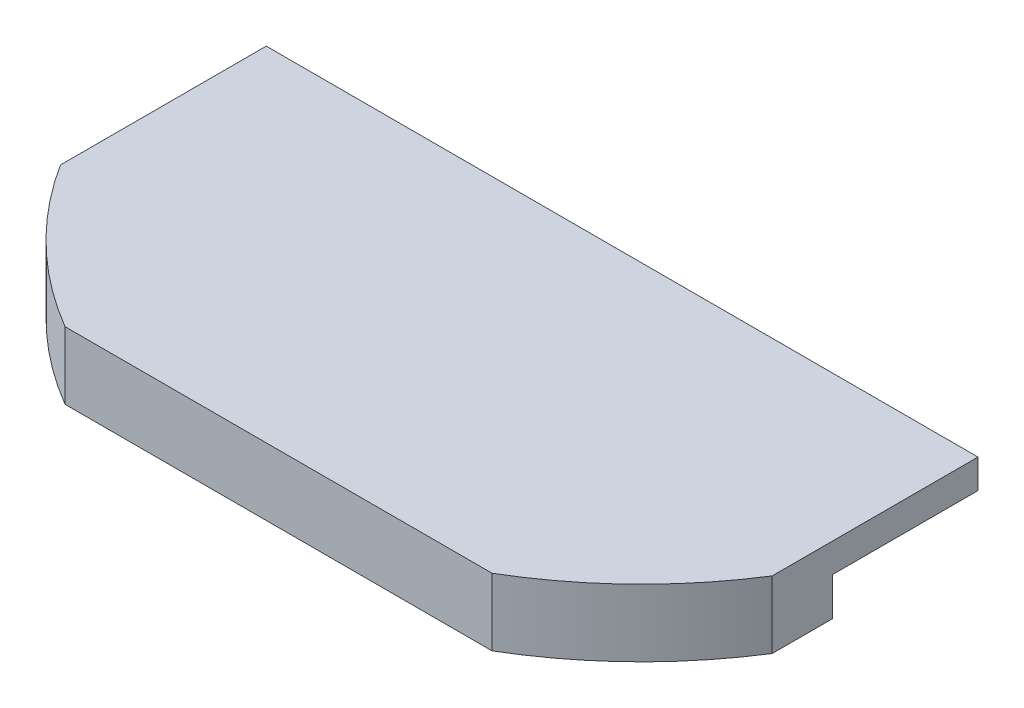
ISO-10303-21;
HEADER;
FILE_DESCRIPTION(('STEP AP214'),'2;1');
FILE_NAME('part.step','',(''),(''),'','','');
FILE_SCHEMA(('AUTOMOTIVE_DESIGN { 1 0 10303 214 1 1 1 1 }'));
ENDSEC;
DATA;
#1=APPLICATION_CONTEXT('core data for automotive mechanical design processes');
#2=APPLICATION_PROTOCOL_DEFINITION('international standard','automotive_design',2000,#1);
#3=PRODUCT_CONTEXT('',#1,'mechanical');
#4=PRODUCT('Part','Part','',(#3));
#5=PRODUCT_RELATED_PRODUCT_CATEGORY('part','',(#4));
#6=PRODUCT_DEFINITION_FORMATION('','',#4);
#7=PRODUCT_DEFINITION_CONTEXT('part definition',#1,'design');
#8=PRODUCT_DEFINITION('design','',#6,#7);
#9=PRODUCT_DEFINITION_SHAPE('','',#8);
#10=(LENGTH_UNIT() NAMED_UNIT(*) SI_UNIT(.MILLI.,.METRE.));
#11=(NAMED_UNIT(*) PLANE_ANGLE_UNIT() SI_UNIT($,.RADIAN.));
#12=(NAMED_UNIT(*) SI_UNIT($,.STERADIAN.) SOLID_ANGLE_UNIT());
#13=UNCERTAINTY_MEASURE_WITH_UNIT(LENGTH_MEASURE(1.E-05),#10,'distance_accuracy_value','');
#14=(GEOMETRIC_REPRESENTATION_CONTEXT(3) GLOBAL_UNCERTAINTY_ASSIGNED_CONTEXT((#13)) GLOBAL_UNIT_ASSIGNED_CONTEXT((#10,
#11,#12)) REPRESENTATION_CONTEXT('',''));
#15=CARTESIAN_POINT('',(0.,0.,0.));
#16=DIRECTION('',(0.,0.,1.));
#17=DIRECTION('',(1.,0.,0.));
#18=AXIS2_PLACEMENT_3D('',#15,#16,#17);
#19=CARTESIAN_POINT('',(0.,0.33,-9.79999999999999));
#20=DIRECTION('',(0.,-1.,0.));
#21=DIRECTION('',(0.,0.,-1.));
#22=AXIS2_PLACEMENT_3D('',#19,#20,#21);
#23=CYLINDRICAL_SURFACE('',#22,27.);
#24=DIRECTION('',(0.,-1.,0.));
#25=VECTOR('',#24,1.);
#26=CARTESIAN_POINT('',(24.5,0.33,1.54680571791023));
#27=LINE('',#26,#25);
#28=CARTESIAN_POINT('',(24.5,0.33,1.54680571791023));
#29=VERTEX_POINT('',#28);
#30=CARTESIAN_POINT('',(24.5,-2.29999999999109,1.54680571791023));
#31=VERTEX_POINT('',#30);
#32=EDGE_CURVE('E48',#29,#31,#27,.T.);
#33=ORIENTED_EDGE('',*,*,#32,.T.);
#34=CARTESIAN_POINT('',(0.,-2.3,-9.79999999999999));
#35=DIRECTION('',(0.,-1.,0.));
#36=DIRECTION('',(0.,0.,1.));
#37=AXIS2_PLACEMENT_3D('',#34,#35,#36);
#38=CIRCLE('',#37,27.);
#39=CARTESIAN_POINT('',(14.142135623731,-2.29999999999109,13.2));
#40=VERTEX_POINT('',#39);
#41=EDGE_CURVE('E162',#31,#40,#38,.T.);
#42=ORIENTED_EDGE('',*,*,#41,.T.);
#43=DIRECTION('',(0.,-1.,0.));
#44=VECTOR('',#43,1.);
#45=CARTESIAN_POINT('',(14.142135623731,0.33,13.2));
#46=LINE('',#45,#44);
#47=CARTESIAN_POINT('',(14.142135623731,0.33,13.2));
#48=VERTEX_POINT('',#47);
#49=EDGE_CURVE('E11',#48,#40,#46,.T.);
#50=ORIENTED_EDGE('',*,*,#49,.F.);
#51=CARTESIAN_POINT('',(0.,0.33,-9.79999999999999));
#52=DIRECTION('',(0.,-1.,0.));
#53=DIRECTION('',(0.,0.,1.));
#54=AXIS2_PLACEMENT_3D('',#51,#52,#53);
#55=CIRCLE('',#54,27.);
#56=EDGE_CURVE('E156',#29,#48,#55,.T.);
#57=ORIENTED_EDGE('',*,*,#56,.F.);
#58=EDGE_LOOP('',(#33,#42,#50,#57));
#59=FACE_BOUND('',#58,.T.);
#60=ADVANCED_FACE('F32',(#59),#23,.F.);
#61=CARTESIAN_POINT('',(14.142135623731,0.33,13.2));
#62=DIRECTION('',(0.,0.,1.));
#63=DIRECTION('',(1.,0.,0.));
#64=AXIS2_PLACEMENT_3D('',#61,#62,#63);
#65=PLANE('',#64);
#66=ORIENTED_EDGE('',*,*,#49,.T.);
#67=DIRECTION('',(-1.,0.,0.));
#68=VECTOR('',#67,1.);
#69=CARTESIAN_POINT('',(14.142135623731,-2.3,13.2));
#70=LINE('',#69,#68);
#71=CARTESIAN_POINT('',(-14.142135623731,-2.29999999999109,13.2));
#72=VERTEX_POINT('',#71);
#73=EDGE_CURVE('E165',#40,#72,#70,.T.);
#74=ORIENTED_EDGE('',*,*,#73,.T.);
#75=DIRECTION('',(0.,-1.,0.));
#76=VECTOR('',#75,1.);
#77=CARTESIAN_POINT('',(-14.142135623731,0.33,13.2));
#78=LINE('',#77,#76);
#79=CARTESIAN_POINT('',(-14.142135623731,0.33,13.2));
#80=VERTEX_POINT('',#79);
#81=EDGE_CURVE('E40',#80,#72,#78,.T.);
#82=ORIENTED_EDGE('',*,*,#81,.F.);
#83=DIRECTION('',(-1.,0.,0.));
#84=VECTOR('',#83,1.);
#85=CARTESIAN_POINT('',(14.142135623731,0.33,13.2));
#86=LINE('',#85,#84);
#87=EDGE_CURVE('E175',#48,#80,#86,.T.);
#88=ORIENTED_EDGE('',*,*,#87,.F.);
#89=EDGE_LOOP('',(#66,#74,#82,#88));
#90=FACE_BOUND('',#89,.T.);
#91=ADVANCED_FACE('F200',(#90),#65,.F.);
#92=CARTESIAN_POINT('',(0.,0.33,-9.79999999999999));
#93=DIRECTION('',(0.,-1.,0.));
#94=DIRECTION('',(0.,0.,-1.));
#95=AXIS2_PLACEMENT_3D('',#92,#93,#94);
#96=CYLINDRICAL_SURFACE('',#95,27.);
#97=ORIENTED_EDGE('',*,*,#81,.T.);
#98=CARTESIAN_POINT('',(0.,-2.29999999999109,-9.79999999999999));
#99=DIRECTION('',(0.,1.,0.));
#100=DIRECTION('',(0.,0.,1.));
#101=AXIS2_PLACEMENT_3D('',#98,#99,#100);
#102=CIRCLE('',#101,27.);
#103=CARTESIAN_POINT('',(-24.5,-2.29999999999109,1.54680571791021));
#104=VERTEX_POINT('',#103);
#105=EDGE_CURVE('E158',#104,#72,#102,.T.);
#106=ORIENTED_EDGE('',*,*,#105,.F.);
#107=DIRECTION('',(0.,-1.,0.));
#108=VECTOR('',#107,1.);
#109=CARTESIAN_POINT('',(-24.5,0.33,1.54680571791021));
#110=LINE('',#109,#108);
#111=CARTESIAN_POINT('',(-24.5,0.33,1.54680571791021));
#112=VERTEX_POINT('',#111);
#113=EDGE_CURVE('E207',#112,#104,#110,.T.);
#114=ORIENTED_EDGE('',*,*,#113,.F.);
#115=CARTESIAN_POINT('',(0.,0.33,-9.79999999999999));
#116=DIRECTION('',(0.,-1.,0.));
#117=DIRECTION('',(0.,0.,1.));
#118=AXIS2_PLACEMENT_3D('',#115,#116,#117);
#119=CIRCLE('',#118,27.);
#120=EDGE_CURVE('E178',#80,#112,#119,.T.);
#121=ORIENTED_EDGE('',*,*,#120,.F.);
#122=EDGE_LOOP('',(#97,#106,#114,#121));
#123=FACE_BOUND('',#122,.T.);
#124=ADVANCED_FACE('F206',(#123),#96,.F.);
#125=CARTESIAN_POINT('',(-24.5,0.33,1.54680571791022));
#126=DIRECTION('',(1.,0.,0.));
#127=DIRECTION('',(0.,0.,-1.));
#128=AXIS2_PLACEMENT_3D('',#125,#126,#127);
#129=PLANE('',#128);
#130=ORIENTED_EDGE('',*,*,#113,.T.);
#131=DIRECTION('',(0.,0.,-1.));
#132=VECTOR('',#131,1.);
#133=CARTESIAN_POINT('',(-24.5,-2.29999999999109,1.54680571791022));
#134=LINE('',#133,#132);
#135=CARTESIAN_POINT('',(-24.5,-2.29999999999109,5.71612064918291));
#136=VERTEX_POINT('',#135);
#137=EDGE_CURVE('E161',#136,#104,#134,.T.);
#138=ORIENTED_EDGE('',*,*,#137,.F.);
#139=DIRECTION('',(0.,-1.,0.));
#140=VECTOR('',#139,1.);
#141=CARTESIAN_POINT('',(-24.5,0.33,5.71612064918291));
#142=LINE('',#141,#140);
#143=CARTESIAN_POINT('',(-24.5,2.33,5.71612064918291));
#144=VERTEX_POINT('',#143);
#145=EDGE_CURVE('E118',#144,#136,#142,.T.);
#146=ORIENTED_EDGE('',*,*,#145,.F.);
#147=DIRECTION('',(0.,0.,1.));
#148=VECTOR('',#147,1.);
#149=CARTESIAN_POINT('',(-24.5,2.33,-8.45319428208977));
#150=LINE('',#149,#148);
#151=CARTESIAN_POINT('',(-24.5,2.33,-8.45319428208977));
#152=VERTEX_POINT('',#151);
#153=EDGE_CURVE('E132',#152,#144,#150,.T.);
#154=ORIENTED_EDGE('',*,*,#153,.F.);
#155=DIRECTION('',(0.,-1.,0.));
#156=VECTOR('',#155,1.);
#157=CARTESIAN_POINT('',(-24.5,2.33,-8.45319428208977));
#158=LINE('',#157,#156);
#159=CARTESIAN_POINT('',(-24.5,0.33,-8.45319428208977));
#160=VERTEX_POINT('',#159);
#161=EDGE_CURVE('E145',#152,#160,#158,.T.);
#162=ORIENTED_EDGE('',*,*,#161,.T.);
#163=DIRECTION('',(0.,0.,1.));
#164=VECTOR('',#163,1.);
#165=CARTESIAN_POINT('',(-24.5,0.33,-8.45319428208977));
#166=LINE('',#165,#164);
#167=EDGE_CURVE('E133',#160,#112,#166,.T.);
#168=ORIENTED_EDGE('',*,*,#167,.T.);
#169=EDGE_LOOP('',(#130,#138,#146,#154,#162,#168));
#170=FACE_BOUND('',#169,.T.);
#171=ADVANCED_FACE('F217',(#170),#129,.F.);
#172=CARTESIAN_POINT('',(0.,0.33,-9.79999999999999));
#173=DIRECTION('',(0.,-1.,0.));
#174=DIRECTION('',(0.,0.,-1.));
#175=AXIS2_PLACEMENT_3D('',#172,#173,#174);
#176=CYLINDRICAL_SURFACE('',#175,29.);
#177=ORIENTED_EDGE('',*,*,#145,.T.);
#178=CARTESIAN_POINT('',(0.,-2.29999999999109,-9.79999999999999));
#179=DIRECTION('',(0.,1.,0.));
#180=DIRECTION('',(0.,0.,1.));
#181=AXIS2_PLACEMENT_3D('',#178,#179,#180);
#182=CIRCLE('',#181,29.);
#183=CARTESIAN_POINT('',(-14.6969384566991,-2.29999999999109,15.2));
#184=VERTEX_POINT('',#183);
#185=EDGE_CURVE('E114',#184,#136,#182,.F.);
#186=ORIENTED_EDGE('',*,*,#185,.F.);
#187=DIRECTION('',(0.,-1.,0.));
#188=VECTOR('',#187,1.);
#189=CARTESIAN_POINT('',(-14.6969384566991,0.33,15.2));
#190=LINE('',#189,#188);
#191=CARTESIAN_POINT('',(-14.6969384566991,2.33,15.2));
#192=VERTEX_POINT('',#191);
#193=EDGE_CURVE('E108',#192,#184,#190,.T.);
#194=ORIENTED_EDGE('',*,*,#193,.F.);
#195=CARTESIAN_POINT('',(0.,2.33,-9.79999999999999));
#196=DIRECTION('',(0.,1.,0.));
#197=DIRECTION('',(0.,0.,1.));
#198=AXIS2_PLACEMENT_3D('',#195,#196,#197);
#199=CIRCLE('',#198,29.);
#200=EDGE_CURVE('E112',#144,#192,#199,.T.);
#201=ORIENTED_EDGE('',*,*,#200,.F.);
#202=EDGE_LOOP('',(#177,#186,#194,#201));
#203=FACE_BOUND('',#202,.T.);
#204=ADVANCED_FACE('F110',(#203),#176,.T.);
#205=CARTESIAN_POINT('',(14.6969384566991,0.33,15.2));
#206=DIRECTION('',(0.,0.,-1.));
#207=DIRECTION('',(-1.,0.,0.));
#208=AXIS2_PLACEMENT_3D('',#205,#206,#207);
#209=PLANE('',#208);
#210=ORIENTED_EDGE('',*,*,#193,.T.);
#211=DIRECTION('',(-1.,0.,0.));
#212=VECTOR('',#211,1.);
#213=CARTESIAN_POINT('',(14.6969384566991,-2.29999999999109,15.2));
#214=LINE('',#213,#212);
#215=CARTESIAN_POINT('',(14.6969384566991,-2.29999999999109,15.2));
#216=VERTEX_POINT('',#215);
#217=EDGE_CURVE('E170',#216,#184,#214,.T.);
#218=ORIENTED_EDGE('',*,*,#217,.F.);
#219=DIRECTION('',(0.,-1.,0.));
#220=VECTOR('',#219,1.);
#221=CARTESIAN_POINT('',(14.6969384566991,0.33,15.2));
#222=LINE('',#221,#220);
#223=CARTESIAN_POINT('',(14.6969384566991,2.33,15.2));
#224=VERTEX_POINT('',#223);
#225=EDGE_CURVE('E119',#224,#216,#222,.T.);
#226=ORIENTED_EDGE('',*,*,#225,.F.);
#227=DIRECTION('',(1.,0.,0.));
#228=VECTOR('',#227,1.);
#229=CARTESIAN_POINT('',(-14.6969384566991,2.33,15.2));
#230=LINE('',#229,#228);
#231=EDGE_CURVE('E122',#192,#224,#230,.T.);
#232=ORIENTED_EDGE('',*,*,#231,.F.);
#233=EDGE_LOOP('',(#210,#218,#226,#232));
#234=FACE_BOUND('',#233,.T.);
#235=ADVANCED_FACE('F123',(#234),#209,.F.);
#236=CARTESIAN_POINT('',(0.,0.33,-9.79999999999999));
#237=DIRECTION('',(0.,-1.,0.));
#238=DIRECTION('',(0.,0.,-1.));
#239=AXIS2_PLACEMENT_3D('',#236,#237,#238);
#240=CYLINDRICAL_SURFACE('',#239,29.);
#241=ORIENTED_EDGE('',*,*,#225,.T.);
#242=CARTESIAN_POINT('',(0.,-2.29999999999109,-9.79999999999999));
#243=DIRECTION('',(0.,1.,0.));
#244=DIRECTION('',(0.,0.,1.));
#245=AXIS2_PLACEMENT_3D('',#242,#243,#244);
#246=CIRCLE('',#245,29.);
#247=CARTESIAN_POINT('',(24.5,-2.29999999999109,5.71612064918292));
#248=VERTEX_POINT('',#247);
#249=EDGE_CURVE('E157',#248,#216,#246,.F.);
#250=ORIENTED_EDGE('',*,*,#249,.F.);
#251=DIRECTION('',(0.,-1.,0.));
#252=VECTOR('',#251,1.);
#253=CARTESIAN_POINT('',(24.5,0.33,5.71612064918292));
#254=LINE('',#253,#252);
#255=CARTESIAN_POINT('',(24.5,2.33,5.71612064918292));
#256=VERTEX_POINT('',#255);
#257=EDGE_CURVE('E181',#256,#248,#254,.T.);
#258=ORIENTED_EDGE('',*,*,#257,.F.);
#259=CARTESIAN_POINT('',(0.,2.33,-9.79999999999999));
#260=DIRECTION('',(0.,1.,0.));
#261=DIRECTION('',(0.,0.,1.));
#262=AXIS2_PLACEMENT_3D('',#259,#260,#261);
#263=CIRCLE('',#262,29.);
#264=EDGE_CURVE('E127',#224,#256,#263,.T.);
#265=ORIENTED_EDGE('',*,*,#264,.F.);
#266=EDGE_LOOP('',(#241,#250,#258,#265));
#267=FACE_BOUND('',#266,.T.);
#268=ADVANCED_FACE('F215',(#267),#240,.T.);
#269=CARTESIAN_POINT('',(24.5,0.33,5.71612064918292));
#270=DIRECTION('',(-1.,0.,0.));
#271=DIRECTION('',(0.,0.,1.));
#272=AXIS2_PLACEMENT_3D('',#269,#270,#271);
#273=PLANE('',#272);
#274=ORIENTED_EDGE('',*,*,#257,.T.);
#275=DIRECTION('',(0.,0.,1.));
#276=VECTOR('',#275,1.);
#277=CARTESIAN_POINT('',(24.5,-2.29999999999109,5.71612064918292));
#278=LINE('',#277,#276);
#279=EDGE_CURVE('E153',#31,#248,#278,.T.);
#280=ORIENTED_EDGE('',*,*,#279,.F.);
#281=ORIENTED_EDGE('',*,*,#32,.F.);
#282=DIRECTION('',(0.,0.,-1.));
#283=VECTOR('',#282,1.);
#284=CARTESIAN_POINT('',(24.5,0.33,1.54680571791023));
#285=LINE('',#284,#283);
#286=CARTESIAN_POINT('',(24.5,0.33,-8.45319428208977));
#287=VERTEX_POINT('',#286);
#288=EDGE_CURVE('E150',#29,#287,#285,.T.);
#289=ORIENTED_EDGE('',*,*,#288,.T.);
#290=DIRECTION('',(0.,-1.,0.));
#291=VECTOR('',#290,1.);
#292=CARTESIAN_POINT('',(24.5,2.33,-8.45319428208977));
#293=LINE('',#292,#291);
#294=CARTESIAN_POINT('',(24.5,2.33,-8.45319428208977));
#295=VERTEX_POINT('',#294);
#296=EDGE_CURVE('E167',#295,#287,#293,.T.);
#297=ORIENTED_EDGE('',*,*,#296,.F.);
#298=DIRECTION('',(0.,0.,-1.));
#299=VECTOR('',#298,1.);
#300=CARTESIAN_POINT('',(24.5,2.33,5.71612064918292));
#301=LINE('',#300,#299);
#302=EDGE_CURVE('E140',#256,#295,#301,.T.);
#303=ORIENTED_EDGE('',*,*,#302,.F.);
#304=EDGE_LOOP('',(#274,#280,#281,#289,#297,#303));
#305=FACE_BOUND('',#304,.T.);
#306=ADVANCED_FACE('F213',(#305),#273,.F.);
#307=CARTESIAN_POINT('',(0.,-2.3,-9.79999999999999));
#308=DIRECTION('',(0.,1.,0.));
#309=DIRECTION('',(0.,0.,1.));
#310=AXIS2_PLACEMENT_3D('',#307,#308,#309);
#311=PLANE('',#310);
#312=ORIENTED_EDGE('',*,*,#137,.T.);
#313=ORIENTED_EDGE('',*,*,#105,.T.);
#314=ORIENTED_EDGE('',*,*,#73,.F.);
#315=ORIENTED_EDGE('',*,*,#41,.F.);
#316=ORIENTED_EDGE('',*,*,#279,.T.);
#317=ORIENTED_EDGE('',*,*,#249,.T.);
#318=ORIENTED_EDGE('',*,*,#217,.T.);
#319=ORIENTED_EDGE('',*,*,#185,.T.);
#320=EDGE_LOOP('',(#312,#313,#314,#315,#316,#317,#318,#319));
#321=FACE_BOUND('',#320,.T.);
#322=ADVANCED_FACE('F203',(#321),#311,.F.);
#323=CARTESIAN_POINT('',(0.,0.33,-9.79999999999999));
#324=DIRECTION('',(0.,1.,0.));
#325=DIRECTION('',(0.,0.,1.));
#326=AXIS2_PLACEMENT_3D('',#323,#324,#325);
#327=PLANE('',#326);
#328=ORIENTED_EDGE('',*,*,#288,.F.);
#329=ORIENTED_EDGE('',*,*,#56,.T.);
#330=ORIENTED_EDGE('',*,*,#87,.T.);
#331=ORIENTED_EDGE('',*,*,#120,.T.);
#332=ORIENTED_EDGE('',*,*,#167,.F.);
#333=DIRECTION('',(-1.,0.,0.));
#334=VECTOR('',#333,1.);
#335=CARTESIAN_POINT('',(24.5,0.33,-8.45319428208977));
#336=LINE('',#335,#334);
#337=EDGE_CURVE('E136',#287,#160,#336,.T.);
#338=ORIENTED_EDGE('',*,*,#337,.F.);
#339=EDGE_LOOP('',(#328,#329,#330,#331,#332,#338));
#340=FACE_BOUND('',#339,.T.);
#341=ADVANCED_FACE('F194',(#340),#327,.F.);
#342=CARTESIAN_POINT('',(24.5,2.33,-8.45319428208977));
#343=DIRECTION('',(0.,0.,1.));
#344=DIRECTION('',(1.,0.,0.));
#345=AXIS2_PLACEMENT_3D('',#342,#343,#344);
#346=PLANE('',#345);
#347=ORIENTED_EDGE('',*,*,#337,.T.);
#348=ORIENTED_EDGE('',*,*,#161,.F.);
#349=DIRECTION('',(-1.,0.,0.));
#350=VECTOR('',#349,1.);
#351=CARTESIAN_POINT('',(24.5,2.33,-8.45319428208977));
#352=LINE('',#351,#350);
#353=EDGE_CURVE('E142',#295,#152,#352,.T.);
#354=ORIENTED_EDGE('',*,*,#353,.F.);
#355=ORIENTED_EDGE('',*,*,#296,.T.);
#356=EDGE_LOOP('',(#347,#348,#354,#355));
#357=FACE_BOUND('',#356,.T.);
#358=ADVANCED_FACE('F223',(#357),#346,.F.);
#359=CARTESIAN_POINT('',(0.,2.33,-9.79999999999999));
#360=DIRECTION('',(0.,1.,0.));
#361=DIRECTION('',(0.,0.,1.));
#362=AXIS2_PLACEMENT_3D('',#359,#360,#361);
#363=PLANE('',#362);
#364=ORIENTED_EDGE('',*,*,#200,.T.);
#365=ORIENTED_EDGE('',*,*,#231,.T.);
#366=ORIENTED_EDGE('',*,*,#264,.T.);
#367=ORIENTED_EDGE('',*,*,#302,.T.);
#368=ORIENTED_EDGE('',*,*,#353,.T.);
#369=ORIENTED_EDGE('',*,*,#153,.T.);
#370=EDGE_LOOP('',(#364,#365,#366,#367,#368,#369));
#371=FACE_BOUND('',#370,.T.);
#372=ADVANCED_FACE('F130',(#371),#363,.T.);
#373=CLOSED_SHELL('',(#60,#91,#124,#171,#204,#235,#268,#306,#322,#341,#358,#372));
#374=MANIFOLD_SOLID_BREP('B2',#373);
#375=ADVANCED_BREP_SHAPE_REPRESENTATION('',(#18,#374),#14);
#376=SHAPE_DEFINITION_REPRESENTATION(#9,#375);
ENDSEC;
END-ISO-10303-21;
